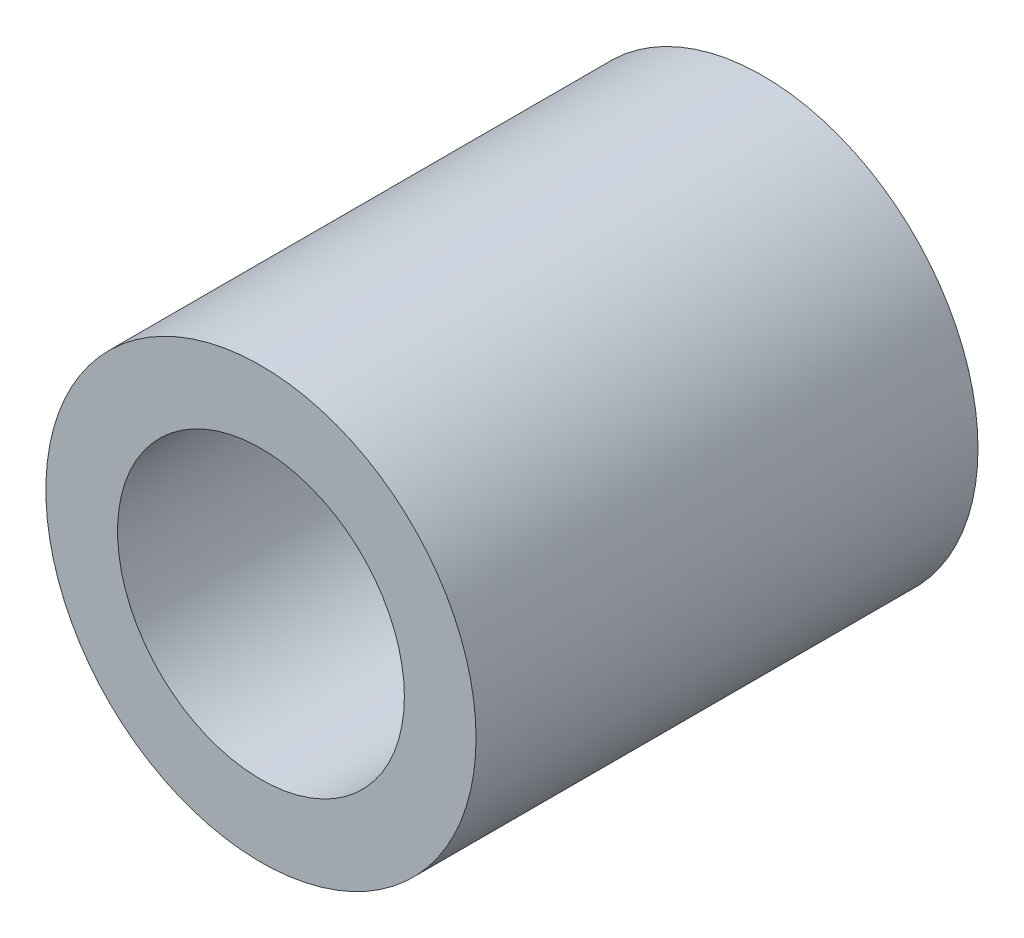
ISO-10303-21;
HEADER;
FILE_DESCRIPTION(('STEP AP214'),'2;1');
FILE_NAME('part.step','',(''),(''),'','','');
FILE_SCHEMA(('AUTOMOTIVE_DESIGN { 1 0 10303 214 1 1 1 1 }'));
ENDSEC;
DATA;
#1=APPLICATION_CONTEXT('core data for automotive mechanical design processes');
#2=APPLICATION_PROTOCOL_DEFINITION('international standard','automotive_design',2000,#1);
#3=PRODUCT_CONTEXT('',#1,'mechanical');
#4=PRODUCT('Part','Part','',(#3));
#5=PRODUCT_RELATED_PRODUCT_CATEGORY('part','',(#4));
#6=PRODUCT_DEFINITION_FORMATION('','',#4);
#7=PRODUCT_DEFINITION_CONTEXT('part definition',#1,'design');
#8=PRODUCT_DEFINITION('design','',#6,#7);
#9=PRODUCT_DEFINITION_SHAPE('','',#8);
#10=(LENGTH_UNIT() NAMED_UNIT(*) SI_UNIT(.MILLI.,.METRE.));
#11=(NAMED_UNIT(*) PLANE_ANGLE_UNIT() SI_UNIT($,.RADIAN.));
#12=(NAMED_UNIT(*) SI_UNIT($,.STERADIAN.) SOLID_ANGLE_UNIT());
#13=UNCERTAINTY_MEASURE_WITH_UNIT(LENGTH_MEASURE(1.E-05),#10,'distance_accuracy_value','');
#14=(GEOMETRIC_REPRESENTATION_CONTEXT(3) GLOBAL_UNCERTAINTY_ASSIGNED_CONTEXT((#13)) GLOBAL_UNIT_ASSIGNED_CONTEXT((#10,
#11,#12)) REPRESENTATION_CONTEXT('',''));
#15=CARTESIAN_POINT('',(0.,0.,0.));
#16=DIRECTION('',(0.,0.,1.));
#17=DIRECTION('',(1.,0.,0.));
#18=AXIS2_PLACEMENT_3D('',#15,#16,#17);
#19=CARTESIAN_POINT('',(0.,0.,7.));
#20=DIRECTION('',(0.,0.,1.));
#21=DIRECTION('',(1.,0.,0.));
#22=AXIS2_PLACEMENT_3D('',#19,#20,#21);
#23=PLANE('',#22);
#24=CARTESIAN_POINT('',(0.,0.,7.));
#25=DIRECTION('',(0.,0.,1.));
#26=DIRECTION('',(1.,0.,0.));
#27=AXIS2_PLACEMENT_3D('',#24,#25,#26);
#28=CIRCLE('',#27,6.);
#29=CARTESIAN_POINT('',(6.,0.,7.));
#30=VERTEX_POINT('',#29);
#31=EDGE_CURVE('E10',#30,#30,#28,.T.);
#32=ORIENTED_EDGE('',*,*,#31,.T.);
#33=EDGE_LOOP('',(#32));
#34=FACE_BOUND('',#33,.T.);
#35=CARTESIAN_POINT('',(0.,0.,7.));
#36=DIRECTION('',(0.,0.,1.));
#37=DIRECTION('',(1.,0.,0.));
#38=AXIS2_PLACEMENT_3D('',#35,#36,#37);
#39=CIRCLE('',#38,4.);
#40=CARTESIAN_POINT('',(4.,0.,7.));
#41=VERTEX_POINT('',#40);
#42=EDGE_CURVE('E50',#41,#41,#39,.T.);
#43=ORIENTED_EDGE('',*,*,#42,.F.);
#44=EDGE_LOOP('',(#43));
#45=FACE_BOUND('',#44,.T.);
#46=ADVANCED_FACE('F37',(#34,#45),#23,.T.);
#47=CARTESIAN_POINT('',(0.,0.,-7.));
#48=DIRECTION('',(0.,0.,1.));
#49=DIRECTION('',(1.,0.,0.));
#50=AXIS2_PLACEMENT_3D('',#47,#48,#49);
#51=PLANE('',#50);
#52=CARTESIAN_POINT('',(0.,0.,-7.));
#53=DIRECTION('',(0.,0.,1.));
#54=DIRECTION('',(1.,0.,0.));
#55=AXIS2_PLACEMENT_3D('',#52,#53,#54);
#56=CIRCLE('',#55,6.);
#57=CARTESIAN_POINT('',(6.,0.,-7.));
#58=VERTEX_POINT('',#57);
#59=EDGE_CURVE('E41',#58,#58,#56,.T.);
#60=ORIENTED_EDGE('',*,*,#59,.F.);
#61=EDGE_LOOP('',(#60));
#62=FACE_BOUND('',#61,.T.);
#63=CARTESIAN_POINT('',(0.,0.,-7.));
#64=DIRECTION('',(0.,0.,1.));
#65=DIRECTION('',(1.,0.,0.));
#66=AXIS2_PLACEMENT_3D('',#63,#64,#65);
#67=CIRCLE('',#66,4.);
#68=CARTESIAN_POINT('',(4.,0.,-7.));
#69=VERTEX_POINT('',#68);
#70=EDGE_CURVE('E52',#69,#69,#67,.T.);
#71=ORIENTED_EDGE('',*,*,#70,.T.);
#72=EDGE_LOOP('',(#71));
#73=FACE_BOUND('',#72,.T.);
#74=ADVANCED_FACE('F64',(#62,#73),#51,.F.);
#75=CARTESIAN_POINT('',(0.,0.,7.));
#76=DIRECTION('',(0.,0.,-1.));
#77=DIRECTION('',(-1.,0.,0.));
#78=AXIS2_PLACEMENT_3D('',#75,#76,#77);
#79=CYLINDRICAL_SURFACE('',#78,6.);
#80=ORIENTED_EDGE('',*,*,#31,.F.);
#81=EDGE_LOOP('',(#80));
#82=FACE_BOUND('',#81,.T.);
#83=ORIENTED_EDGE('',*,*,#59,.T.);
#84=EDGE_LOOP('',(#83));
#85=FACE_BOUND('',#84,.T.);
#86=ADVANCED_FACE('F39',(#82,#85),#79,.T.);
#87=CARTESIAN_POINT('',(0.,0.,7.));
#88=DIRECTION('',(0.,0.,-1.));
#89=DIRECTION('',(-1.,0.,0.));
#90=AXIS2_PLACEMENT_3D('',#87,#88,#89);
#91=CYLINDRICAL_SURFACE('',#90,4.);
#92=ORIENTED_EDGE('',*,*,#42,.T.);
#93=EDGE_LOOP('',(#92));
#94=FACE_BOUND('',#93,.T.);
#95=ORIENTED_EDGE('',*,*,#70,.F.);
#96=EDGE_LOOP('',(#95));
#97=FACE_BOUND('',#96,.T.);
#98=ADVANCED_FACE('F60',(#94,#97),#91,.F.);
#99=CLOSED_SHELL('',(#46,#74,#86,#98));
#100=MANIFOLD_SOLID_BREP('B2',#99);
#101=ADVANCED_BREP_SHAPE_REPRESENTATION('',(#18,#100),#14);
#102=SHAPE_DEFINITION_REPRESENTATION(#9,#101);
ENDSEC;
END-ISO-10303-21;
